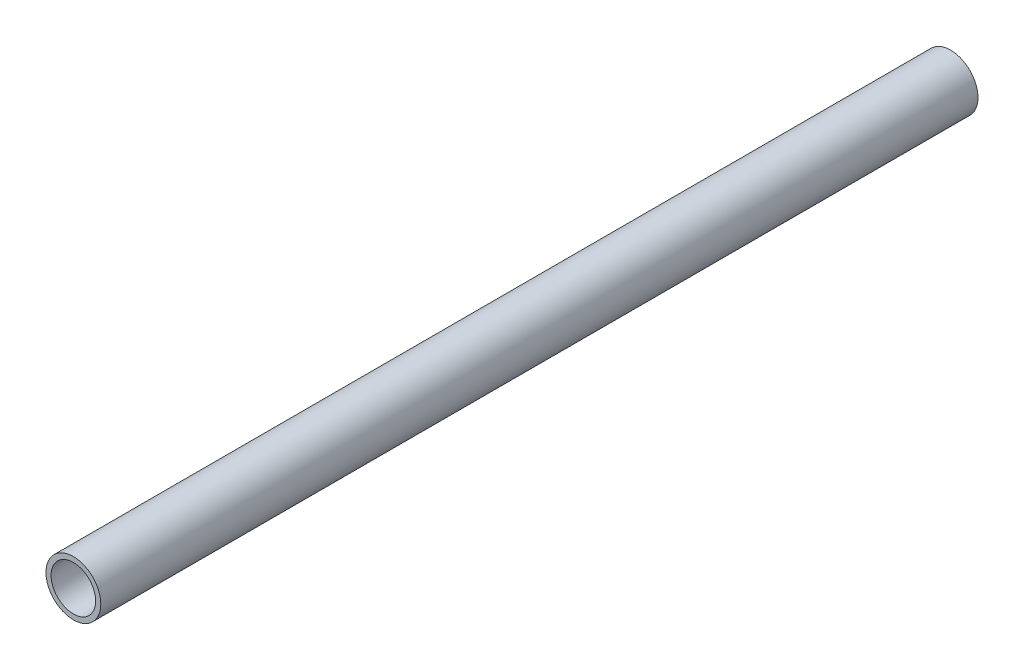
ISO-10303-21;
HEADER;
FILE_DESCRIPTION(('STEP AP214'),'2;1');
FILE_NAME('part.step','',(''),(''),'','','');
FILE_SCHEMA(('AUTOMOTIVE_DESIGN { 1 0 10303 214 1 1 1 1 }'));
ENDSEC;
DATA;
#1=APPLICATION_CONTEXT('core data for automotive mechanical design processes');
#2=APPLICATION_PROTOCOL_DEFINITION('international standard','automotive_design',2000,#1);
#3=PRODUCT_CONTEXT('',#1,'mechanical');
#4=PRODUCT('Part','Part','',(#3));
#5=PRODUCT_RELATED_PRODUCT_CATEGORY('part','',(#4));
#6=PRODUCT_DEFINITION_FORMATION('','',#4);
#7=PRODUCT_DEFINITION_CONTEXT('part definition',#1,'design');
#8=PRODUCT_DEFINITION('design','',#6,#7);
#9=PRODUCT_DEFINITION_SHAPE('','',#8);
#10=(LENGTH_UNIT() NAMED_UNIT(*) SI_UNIT(.MILLI.,.METRE.));
#11=(NAMED_UNIT(*) PLANE_ANGLE_UNIT() SI_UNIT($,.RADIAN.));
#12=(NAMED_UNIT(*) SI_UNIT($,.STERADIAN.) SOLID_ANGLE_UNIT());
#13=UNCERTAINTY_MEASURE_WITH_UNIT(LENGTH_MEASURE(1.E-05),#10,'distance_accuracy_value','');
#14=(GEOMETRIC_REPRESENTATION_CONTEXT(3) GLOBAL_UNCERTAINTY_ASSIGNED_CONTEXT((#13)) GLOBAL_UNIT_ASSIGNED_CONTEXT((#10,
#11,#12)) REPRESENTATION_CONTEXT('',''));
#15=CARTESIAN_POINT('',(0.,0.,0.));
#16=DIRECTION('',(0.,0.,1.));
#17=DIRECTION('',(1.,0.,0.));
#18=AXIS2_PLACEMENT_3D('',#15,#16,#17);
#19=CARTESIAN_POINT('',(0.,0.,76.2));
#20=DIRECTION('',(0.,0.,1.));
#21=DIRECTION('',(1.,0.,0.));
#22=AXIS2_PLACEMENT_3D('',#19,#20,#21);
#23=PLANE('',#22);
#24=CARTESIAN_POINT('',(0.,0.,76.2));
#25=DIRECTION('',(0.,0.,1.));
#26=DIRECTION('',(1.,0.,0.));
#27=AXIS2_PLACEMENT_3D('',#24,#25,#26);
#28=CIRCLE('',#27,4.7625);
#29=CARTESIAN_POINT('',(4.7625,0.,76.2));
#30=VERTEX_POINT('',#29);
#31=EDGE_CURVE('E10',#30,#30,#28,.T.);
#32=ORIENTED_EDGE('',*,*,#31,.T.);
#33=EDGE_LOOP('',(#32));
#34=FACE_BOUND('',#33,.T.);
#35=CARTESIAN_POINT('',(0.,0.,76.2));
#36=DIRECTION('',(0.,0.,1.));
#37=DIRECTION('',(1.,0.,0.));
#38=AXIS2_PLACEMENT_3D('',#35,#36,#37);
#39=CIRCLE('',#38,3.8735);
#40=CARTESIAN_POINT('',(3.8735,0.,76.2));
#41=VERTEX_POINT('',#40);
#42=EDGE_CURVE('E37',#41,#41,#39,.T.);
#43=ORIENTED_EDGE('',*,*,#42,.F.);
#44=EDGE_LOOP('',(#43));
#45=FACE_BOUND('',#44,.T.);
#46=ADVANCED_FACE('F30',(#34,#45),#23,.T.);
#47=CARTESIAN_POINT('',(0.,0.,76.2));
#48=DIRECTION('',(0.,0.,-1.));
#49=DIRECTION('',(-1.,0.,0.));
#50=AXIS2_PLACEMENT_3D('',#47,#48,#49);
#51=CYLINDRICAL_SURFACE('',#50,4.7625);
#52=ORIENTED_EDGE('',*,*,#31,.F.);
#53=EDGE_LOOP('',(#52));
#54=FACE_BOUND('',#53,.T.);
#55=CARTESIAN_POINT('',(0.,0.,-76.2));
#56=DIRECTION('',(0.,0.,1.));
#57=DIRECTION('',(1.,0.,0.));
#58=AXIS2_PLACEMENT_3D('',#55,#56,#57);
#59=CIRCLE('',#58,4.7625);
#60=CARTESIAN_POINT('',(4.7625,0.,-76.2));
#61=VERTEX_POINT('',#60);
#62=EDGE_CURVE('E41',#61,#61,#59,.T.);
#63=ORIENTED_EDGE('',*,*,#62,.T.);
#64=EDGE_LOOP('',(#63));
#65=FACE_BOUND('',#64,.T.);
#66=ADVANCED_FACE('F32',(#54,#65),#51,.T.);
#67=CARTESIAN_POINT('',(0.,0.,76.2));
#68=DIRECTION('',(0.,0.,-1.));
#69=DIRECTION('',(-1.,0.,0.));
#70=AXIS2_PLACEMENT_3D('',#67,#68,#69);
#71=CYLINDRICAL_SURFACE('',#70,3.8735);
#72=ORIENTED_EDGE('',*,*,#42,.T.);
#73=EDGE_LOOP('',(#72));
#74=FACE_BOUND('',#73,.T.);
#75=CARTESIAN_POINT('',(0.,0.,-76.2));
#76=DIRECTION('',(0.,0.,1.));
#77=DIRECTION('',(1.,0.,0.));
#78=AXIS2_PLACEMENT_3D('',#75,#76,#77);
#79=CIRCLE('',#78,3.8735);
#80=CARTESIAN_POINT('',(3.8735,0.,-76.2));
#81=VERTEX_POINT('',#80);
#82=EDGE_CURVE('E45',#81,#81,#79,.T.);
#83=ORIENTED_EDGE('',*,*,#82,.F.);
#84=EDGE_LOOP('',(#83));
#85=FACE_BOUND('',#84,.T.);
#86=ADVANCED_FACE('F54',(#74,#85),#71,.F.);
#87=CARTESIAN_POINT('',(0.,0.,-76.2));
#88=DIRECTION('',(0.,0.,1.));
#89=DIRECTION('',(1.,0.,0.));
#90=AXIS2_PLACEMENT_3D('',#87,#88,#89);
#91=PLANE('',#90);
#92=ORIENTED_EDGE('',*,*,#82,.T.);
#93=EDGE_LOOP('',(#92));
#94=FACE_BOUND('',#93,.T.);
#95=ORIENTED_EDGE('',*,*,#62,.F.);
#96=EDGE_LOOP('',(#95));
#97=FACE_BOUND('',#96,.T.);
#98=ADVANCED_FACE('F51',(#94,#97),#91,.F.);
#99=CLOSED_SHELL('',(#46,#66,#86,#98));
#100=MANIFOLD_SOLID_BREP('B2',#99);
#101=ADVANCED_BREP_SHAPE_REPRESENTATION('',(#18,#100),#14);
#102=SHAPE_DEFINITION_REPRESENTATION(#9,#101);
ENDSEC;
END-ISO-10303-21;
